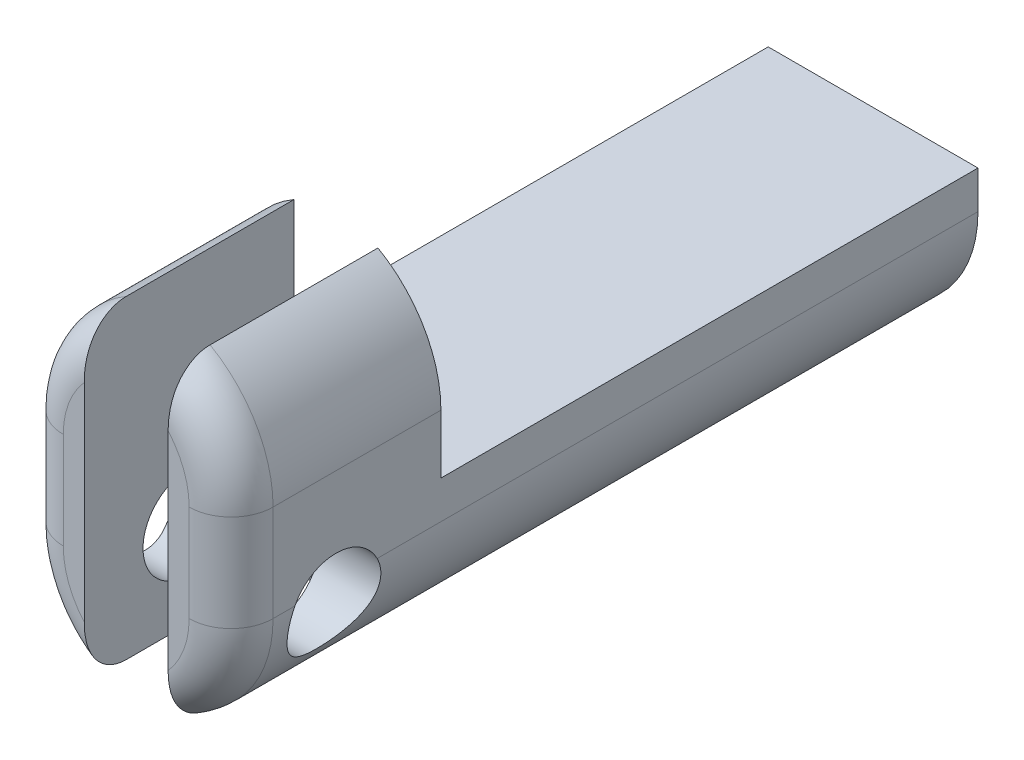
ISO-10303-21;
HEADER;
FILE_DESCRIPTION(('STEP AP214'),'2;1');
FILE_NAME('part.step','',(''),(''),'','','');
FILE_SCHEMA(('AUTOMOTIVE_DESIGN { 1 0 10303 214 1 1 1 1 }'));
ENDSEC;
DATA;
#1=APPLICATION_CONTEXT('core data for automotive mechanical design processes');
#2=APPLICATION_PROTOCOL_DEFINITION('international standard','automotive_design',2000,#1);
#3=PRODUCT_CONTEXT('',#1,'mechanical');
#4=PRODUCT('Part','Part','',(#3));
#5=PRODUCT_RELATED_PRODUCT_CATEGORY('part','',(#4));
#6=PRODUCT_DEFINITION_FORMATION('','',#4);
#7=PRODUCT_DEFINITION_CONTEXT('part definition',#1,'design');
#8=PRODUCT_DEFINITION('design','',#6,#7);
#9=PRODUCT_DEFINITION_SHAPE('','',#8);
#10=(LENGTH_UNIT() NAMED_UNIT(*) SI_UNIT(.MILLI.,.METRE.));
#11=(NAMED_UNIT(*) PLANE_ANGLE_UNIT() SI_UNIT($,.RADIAN.));
#12=(NAMED_UNIT(*) SI_UNIT($,.STERADIAN.) SOLID_ANGLE_UNIT());
#13=UNCERTAINTY_MEASURE_WITH_UNIT(LENGTH_MEASURE(1.E-05),#10,'distance_accuracy_value','');
#14=(GEOMETRIC_REPRESENTATION_CONTEXT(3) GLOBAL_UNCERTAINTY_ASSIGNED_CONTEXT((#13)) GLOBAL_UNIT_ASSIGNED_CONTEXT((#10,
#11,#12)) REPRESENTATION_CONTEXT('',''));
#15=CARTESIAN_POINT('',(0.,0.,0.));
#16=DIRECTION('',(0.,0.,1.));
#17=DIRECTION('',(1.,0.,0.));
#18=AXIS2_PLACEMENT_3D('',#15,#16,#17);
#19=CARTESIAN_POINT('',(0.,0.,12.8));
#20=DIRECTION('',(0.,0.,1.));
#21=DIRECTION('',(1.,0.,0.));
#22=AXIS2_PLACEMENT_3D('',#19,#20,#21);
#23=PLANE('',#22);
#24=DIRECTION('',(0.,1.,0.));
#25=VECTOR('',#24,1.);
#26=CARTESIAN_POINT('',(-1.,-1.95,12.8));
#27=LINE('',#26,#25);
#28=CARTESIAN_POINT('',(-1.,-1.54807621135331,12.8));
#29=VERTEX_POINT('',#28);
#30=CARTESIAN_POINT('',(-1.,1.95,12.8));
#31=VERTEX_POINT('',#30);
#32=EDGE_CURVE('E203',#29,#31,#27,.T.);
#33=ORIENTED_EDGE('',*,*,#32,.F.);
#34=CARTESIAN_POINT('',(0.5,1.05,12.8));
#35=DIRECTION('',(0.,0.,1.));
#36=DIRECTION('',(1.,0.,0.));
#37=AXIS2_PLACEMENT_3D('',#34,#35,#36);
#38=CIRCLE('',#37,3.);
#39=CARTESIAN_POINT('',(0.,-1.90803989154981,12.8));
#40=VERTEX_POINT('',#39);
#41=EDGE_CURVE('E498',#29,#40,#38,.T.);
#42=ORIENTED_EDGE('',*,*,#41,.T.);
#43=CARTESIAN_POINT('',(-0.5,1.05,12.8));
#44=DIRECTION('',(0.,0.,1.));
#45=DIRECTION('',(1.,0.,0.));
#46=AXIS2_PLACEMENT_3D('',#43,#44,#45);
#47=CIRCLE('',#46,3.);
#48=CARTESIAN_POINT('',(1.,-1.54807621135331,12.8));
#49=VERTEX_POINT('',#48);
#50=EDGE_CURVE('E500',#40,#49,#47,.T.);
#51=ORIENTED_EDGE('',*,*,#50,.T.);
#52=DIRECTION('',(0.,-1.,0.));
#53=VECTOR('',#52,1.);
#54=CARTESIAN_POINT('',(1.,5.95,12.8));
#55=LINE('',#54,#53);
#56=CARTESIAN_POINT('',(1.,1.95,12.8));
#57=VERTEX_POINT('',#56);
#58=EDGE_CURVE('E227',#57,#49,#55,.T.);
#59=ORIENTED_EDGE('',*,*,#58,.F.);
#60=DIRECTION('',(-1.,0.,0.));
#61=VECTOR('',#60,1.);
#62=CARTESIAN_POINT('',(2.5,1.95,12.8));
#63=LINE('',#62,#61);
#64=EDGE_CURVE('E244',#57,#31,#63,.T.);
#65=ORIENTED_EDGE('',*,*,#64,.T.);
#66=EDGE_LOOP('',(#33,#42,#51,#59,#65));
#67=FACE_BOUND('',#66,.T.);
#68=ADVANCED_FACE('F47',(#67),#23,.T.);
#69=CARTESIAN_POINT('',(2.5,-1.95,12.8));
#70=DIRECTION('',(-1.,0.,0.));
#71=DIRECTION('',(0.,-1.,0.));
#72=AXIS2_PLACEMENT_3D('',#69,#70,#71);
#73=PLANE('',#72);
#74=DIRECTION('',(0.,0.,1.));
#75=VECTOR('',#74,1.);
#76=CARTESIAN_POINT('',(2.5,3.35192378864669,12.8));
#77=LINE('',#76,#75);
#78=CARTESIAN_POINT('',(2.5,3.35192378864669,12.8));
#79=VERTEX_POINT('',#78);
#80=CARTESIAN_POINT('',(2.5,3.35192378864669,16.8));
#81=VERTEX_POINT('',#80);
#82=EDGE_CURVE('E422',#79,#81,#77,.T.);
#83=ORIENTED_EDGE('',*,*,#82,.T.);
#84=DIRECTION('',(0.,1.,0.));
#85=VECTOR('',#84,1.);
#86=CARTESIAN_POINT('',(2.5,1.05,16.8));
#87=LINE('',#86,#85);
#88=CARTESIAN_POINT('',(2.5,1.05,16.8));
#89=VERTEX_POINT('',#88);
#90=EDGE_CURVE('E425',#81,#89,#87,.F.);
#91=ORIENTED_EDGE('',*,*,#90,.T.);
#92=DIRECTION('',(0.,0.,-1.));
#93=VECTOR('',#92,1.);
#94=CARTESIAN_POINT('',(2.5,1.05,12.8));
#95=LINE('',#94,#93);
#96=CARTESIAN_POINT('',(2.5,1.05,16.2797958971133));
#97=VERTEX_POINT('',#96);
#98=EDGE_CURVE('E316',#89,#97,#95,.T.);
#99=ORIENTED_EDGE('',*,*,#98,.T.);
#100=CARTESIAN_POINT('',(2.5,0.55,15.3));
#101=DIRECTION('',(1.,0.,0.));
#102=DIRECTION('',(0.,1.,0.));
#103=AXIS2_PLACEMENT_3D('',#100,#101,#102);
#104=CIRCLE('',#103,1.1);
#105=CARTESIAN_POINT('',(2.5,1.05,14.3202041028867));
#106=VERTEX_POINT('',#105);
#107=EDGE_CURVE('E511',#106,#97,#104,.T.);
#108=ORIENTED_EDGE('',*,*,#107,.F.);
#109=DIRECTION('',(0.,0.,-1.));
#110=VECTOR('',#109,1.);
#111=CARTESIAN_POINT('',(2.5,1.05,12.8));
#112=LINE('',#111,#110);
#113=CARTESIAN_POINT('',(2.5,1.05,0.));
#114=VERTEX_POINT('',#113);
#115=EDGE_CURVE('E503',#106,#114,#112,.T.);
#116=ORIENTED_EDGE('',*,*,#115,.T.);
#117=DIRECTION('',(0.,1.,0.));
#118=VECTOR('',#117,1.);
#119=CARTESIAN_POINT('',(2.5,-1.95,0.));
#120=LINE('',#119,#118);
#121=CARTESIAN_POINT('',(2.5,1.95,0.));
#122=VERTEX_POINT('',#121);
#123=EDGE_CURVE('E235',#114,#122,#120,.T.);
#124=ORIENTED_EDGE('',*,*,#123,.T.);
#125=DIRECTION('',(0.,0.,-1.));
#126=VECTOR('',#125,1.);
#127=CARTESIAN_POINT('',(2.5,1.95,12.8));
#128=LINE('',#127,#126);
#129=CARTESIAN_POINT('',(2.5,1.95,12.8));
#130=VERTEX_POINT('',#129);
#131=EDGE_CURVE('E258',#130,#122,#128,.T.);
#132=ORIENTED_EDGE('',*,*,#131,.F.);
#133=DIRECTION('',(0.,1.,0.));
#134=VECTOR('',#133,1.);
#135=CARTESIAN_POINT('',(2.5,-1.95,12.8));
#136=LINE('',#135,#134);
#137=EDGE_CURVE('E209',#130,#79,#136,.T.);
#138=ORIENTED_EDGE('',*,*,#137,.T.);
#139=EDGE_LOOP('',(#83,#91,#99,#108,#116,#124,#132,#138));
#140=FACE_BOUND('',#139,.T.);
#141=ADVANCED_FACE('F405',(#140),#73,.F.);
#142=CARTESIAN_POINT('',(2.5,1.95,12.8));
#143=DIRECTION('',(0.,-1.,0.));
#144=DIRECTION('',(1.,0.,0.));
#145=AXIS2_PLACEMENT_3D('',#142,#143,#144);
#146=PLANE('',#145);
#147=DIRECTION('',(-1.,0.,0.));
#148=VECTOR('',#147,1.);
#149=CARTESIAN_POINT('',(2.5,1.95,0.));
#150=LINE('',#149,#148);
#151=CARTESIAN_POINT('',(-2.5,1.95,0.));
#152=VERTEX_POINT('',#151);
#153=EDGE_CURVE('E248',#122,#152,#150,.T.);
#154=ORIENTED_EDGE('',*,*,#153,.T.);
#155=DIRECTION('',(0.,0.,-1.));
#156=VECTOR('',#155,1.);
#157=CARTESIAN_POINT('',(-2.5,1.95,12.8));
#158=LINE('',#157,#156);
#159=CARTESIAN_POINT('',(-2.5,1.95,12.8));
#160=VERTEX_POINT('',#159);
#161=EDGE_CURVE('E243',#160,#152,#158,.T.);
#162=ORIENTED_EDGE('',*,*,#161,.F.);
#163=EDGE_CURVE('E245',#31,#160,#63,.T.);
#164=ORIENTED_EDGE('',*,*,#163,.F.);
#165=ORIENTED_EDGE('',*,*,#64,.F.);
#166=EDGE_CURVE('E239',#130,#57,#63,.T.);
#167=ORIENTED_EDGE('',*,*,#166,.F.);
#168=ORIENTED_EDGE('',*,*,#131,.T.);
#169=EDGE_LOOP('',(#154,#162,#164,#165,#167,#168));
#170=FACE_BOUND('',#169,.T.);
#171=ADVANCED_FACE('F413',(#170),#146,.F.);
#172=CARTESIAN_POINT('',(-2.5,1.95,12.8));
#173=DIRECTION('',(1.,0.,0.));
#174=DIRECTION('',(0.,1.,0.));
#175=AXIS2_PLACEMENT_3D('',#172,#173,#174);
#176=PLANE('',#175);
#177=DIRECTION('',(0.,0.,-1.));
#178=VECTOR('',#177,1.);
#179=CARTESIAN_POINT('',(-2.5,1.05,12.8));
#180=LINE('',#179,#178);
#181=CARTESIAN_POINT('',(-2.5,1.05,16.2797958971133));
#182=VERTEX_POINT('',#181);
#183=CARTESIAN_POINT('',(-2.5,1.05,16.8));
#184=VERTEX_POINT('',#183);
#185=EDGE_CURVE('E273',#182,#184,#180,.F.);
#186=ORIENTED_EDGE('',*,*,#185,.T.);
#187=DIRECTION('',(0.,-1.,0.));
#188=VECTOR('',#187,1.);
#189=CARTESIAN_POINT('',(-2.5,3.35192378864669,16.8));
#190=LINE('',#189,#188);
#191=CARTESIAN_POINT('',(-2.5,3.35192378864668,16.8));
#192=VERTEX_POINT('',#191);
#193=EDGE_CURVE('E354',#184,#192,#190,.F.);
#194=ORIENTED_EDGE('',*,*,#193,.T.);
#195=DIRECTION('',(0.,0.,-1.));
#196=VECTOR('',#195,1.);
#197=CARTESIAN_POINT('',(-2.5,3.35192378864668,12.8));
#198=LINE('',#197,#196);
#199=CARTESIAN_POINT('',(-2.5,3.35192378864669,12.8));
#200=VERTEX_POINT('',#199);
#201=EDGE_CURVE('E198',#192,#200,#198,.T.);
#202=ORIENTED_EDGE('',*,*,#201,.T.);
#203=DIRECTION('',(0.,-1.,0.));
#204=VECTOR('',#203,1.);
#205=CARTESIAN_POINT('',(-2.5,5.95,12.8));
#206=LINE('',#205,#204);
#207=EDGE_CURVE('E195',#200,#160,#206,.T.);
#208=ORIENTED_EDGE('',*,*,#207,.T.);
#209=ORIENTED_EDGE('',*,*,#161,.T.);
#210=DIRECTION('',(0.,-1.,0.));
#211=VECTOR('',#210,1.);
#212=CARTESIAN_POINT('',(-2.5,1.95,0.));
#213=LINE('',#212,#211);
#214=CARTESIAN_POINT('',(-2.5,1.05,0.));
#215=VERTEX_POINT('',#214);
#216=EDGE_CURVE('E251',#152,#215,#213,.T.);
#217=ORIENTED_EDGE('',*,*,#216,.T.);
#218=DIRECTION('',(0.,0.,-1.));
#219=VECTOR('',#218,1.);
#220=CARTESIAN_POINT('',(-2.5,1.05,12.8));
#221=LINE('',#220,#219);
#222=CARTESIAN_POINT('',(-2.5,1.05,14.3202041028867));
#223=VERTEX_POINT('',#222);
#224=EDGE_CURVE('E277',#215,#223,#221,.F.);
#225=ORIENTED_EDGE('',*,*,#224,.T.);
#226=CARTESIAN_POINT('',(-2.5,0.549999999999999,15.3));
#227=DIRECTION('',(1.,0.,0.));
#228=DIRECTION('',(0.,1.,0.));
#229=AXIS2_PLACEMENT_3D('',#226,#227,#228);
#230=CIRCLE('',#229,1.1);
#231=EDGE_CURVE('E266',#223,#182,#230,.T.);
#232=ORIENTED_EDGE('',*,*,#231,.T.);
#233=EDGE_LOOP('',(#186,#194,#202,#208,#209,#217,#225,#232));
#234=FACE_BOUND('',#233,.T.);
#235=ADVANCED_FACE('F409',(#234),#176,.F.);
#236=CARTESIAN_POINT('',(0.,0.,0.));
#237=DIRECTION('',(0.,0.,1.));
#238=DIRECTION('',(1.,0.,0.));
#239=AXIS2_PLACEMENT_3D('',#236,#237,#238);
#240=PLANE('',#239);
#241=CARTESIAN_POINT('',(0.,-0.0499999999999999,0.));
#242=DIRECTION('',(0.,0.,-1.));
#243=DIRECTION('',(-1.,0.,0.));
#244=AXIS2_PLACEMENT_3D('',#241,#242,#243);
#245=CIRCLE('',#244,1.);
#246=CARTESIAN_POINT('',(-1.,-0.0499999999999999,0.));
#247=VERTEX_POINT('',#246);
#248=EDGE_CURVE('E230',#247,#247,#245,.T.);
#249=ORIENTED_EDGE('',*,*,#248,.F.);
#250=EDGE_LOOP('',(#249));
#251=FACE_BOUND('',#250,.T.);
#252=CARTESIAN_POINT('',(-0.5,1.05,0.));
#253=DIRECTION('',(0.,0.,1.));
#254=DIRECTION('',(1.,0.,0.));
#255=AXIS2_PLACEMENT_3D('',#252,#253,#254);
#256=CIRCLE('',#255,3.);
#257=CARTESIAN_POINT('',(0.,-1.90803989154981,0.));
#258=VERTEX_POINT('',#257);
#259=EDGE_CURVE('E267',#114,#258,#256,.F.);
#260=ORIENTED_EDGE('',*,*,#259,.T.);
#261=CARTESIAN_POINT('',(0.5,1.05,0.));
#262=DIRECTION('',(0.,0.,1.));
#263=DIRECTION('',(1.,0.,0.));
#264=AXIS2_PLACEMENT_3D('',#261,#262,#263);
#265=CIRCLE('',#264,3.);
#266=EDGE_CURVE('E270',#258,#215,#265,.F.);
#267=ORIENTED_EDGE('',*,*,#266,.T.);
#268=ORIENTED_EDGE('',*,*,#216,.F.);
#269=ORIENTED_EDGE('',*,*,#153,.F.);
#270=ORIENTED_EDGE('',*,*,#123,.F.);
#271=EDGE_LOOP('',(#260,#267,#268,#269,#270));
#272=FACE_BOUND('',#271,.T.);
#273=ADVANCED_FACE('F401',(#251,#272),#240,.F.);
#274=CARTESIAN_POINT('',(0.,-0.0499999999999999,5.));
#275=DIRECTION('',(0.,0.,-1.));
#276=DIRECTION('',(-1.,0.,0.));
#277=AXIS2_PLACEMENT_3D('',#274,#275,#276);
#278=CYLINDRICAL_SURFACE('',#277,1.);
#279=CARTESIAN_POINT('',(0.,-0.0499999999999999,5.));
#280=DIRECTION('',(0.,0.,-1.));
#281=DIRECTION('',(-1.,0.,0.));
#282=AXIS2_PLACEMENT_3D('',#279,#280,#281);
#283=CIRCLE('',#282,1.);
#284=CARTESIAN_POINT('',(-1.,-0.0499999999999999,5.));
#285=VERTEX_POINT('',#284);
#286=EDGE_CURVE('E231',#285,#285,#283,.T.);
#287=ORIENTED_EDGE('',*,*,#286,.F.);
#288=EDGE_LOOP('',(#287));
#289=FACE_BOUND('',#288,.T.);
#290=ORIENTED_EDGE('',*,*,#248,.T.);
#291=EDGE_LOOP('',(#290));
#292=FACE_BOUND('',#291,.T.);
#293=ADVANCED_FACE('F397',(#289,#292),#278,.F.);
#294=CARTESIAN_POINT('',(0.,-0.0499999999999999,5.));
#295=DIRECTION('',(0.,0.,-1.));
#296=DIRECTION('',(-1.,0.,0.));
#297=AXIS2_PLACEMENT_3D('',#294,#295,#296);
#298=PLANE('',#297);
#299=ORIENTED_EDGE('',*,*,#286,.T.);
#300=EDGE_LOOP('',(#299));
#301=FACE_BOUND('',#300,.T.);
#302=ADVANCED_FACE('F393',(#301),#298,.T.);
#303=CARTESIAN_POINT('',(0.,0.,12.8));
#304=DIRECTION('',(0.,0.,1.));
#305=DIRECTION('',(1.,0.,0.));
#306=AXIS2_PLACEMENT_3D('',#303,#304,#305);
#307=PLANE('',#306);
#308=CARTESIAN_POINT('',(1.,5.95,12.8));
#309=VERTEX_POINT('',#308);
#310=EDGE_CURVE('E220',#309,#57,#55,.T.);
#311=ORIENTED_EDGE('',*,*,#310,.F.);
#312=CARTESIAN_POINT('',(-0.500000000000001,3.35192378864669,12.8));
#313=DIRECTION('',(0.,0.,1.));
#314=DIRECTION('',(1.,0.,0.));
#315=AXIS2_PLACEMENT_3D('',#312,#313,#314);
#316=CIRCLE('',#315,3.);
#317=EDGE_CURVE('E431',#309,#79,#316,.F.);
#318=ORIENTED_EDGE('',*,*,#317,.T.);
#319=ORIENTED_EDGE('',*,*,#137,.F.);
#320=ORIENTED_EDGE('',*,*,#166,.T.);
#321=EDGE_LOOP('',(#311,#318,#319,#320));
#322=FACE_BOUND('',#321,.T.);
#323=ADVANCED_FACE('F390',(#322),#307,.F.);
#324=CARTESIAN_POINT('',(1.,5.95,17.8));
#325=DIRECTION('',(1.,0.,0.));
#326=DIRECTION('',(0.,1.,0.));
#327=AXIS2_PLACEMENT_3D('',#324,#325,#326);
#328=PLANE('',#327);
#329=CARTESIAN_POINT('',(1.,0.55,15.3));
#330=DIRECTION('',(1.,0.,0.));
#331=DIRECTION('',(0.,1.,0.));
#332=AXIS2_PLACEMENT_3D('',#329,#330,#331);
#333=CIRCLE('',#332,1.1);
#334=CARTESIAN_POINT('',(1.,1.65,15.3));
#335=VERTEX_POINT('',#334);
#336=EDGE_CURVE('E188',#335,#335,#333,.T.);
#337=ORIENTED_EDGE('',*,*,#336,.T.);
#338=EDGE_LOOP('',(#337));
#339=FACE_BOUND('',#338,.T.);
#340=DIRECTION('',(0.,0.,-1.));
#341=VECTOR('',#340,1.);
#342=CARTESIAN_POINT('',(1.,-1.54807621135331,12.8));
#343=LINE('',#342,#341);
#344=CARTESIAN_POINT('',(1.,-1.54807621135331,16.8));
#345=VERTEX_POINT('',#344);
#346=EDGE_CURVE('E315',#49,#345,#343,.F.);
#347=ORIENTED_EDGE('',*,*,#346,.T.);
#348=CARTESIAN_POINT('',(1.,-1.54807621135331,16.8));
#349=CARTESIAN_POINT('',(1.,-1.54807725914633,16.8251406847583));
#350=CARTESIAN_POINT('',(1.,-1.54698065946931,16.8502685668927));
#351=CARTESIAN_POINT('',(1.,-1.54261438234622,16.900328936466));
#352=CARTESIAN_POINT('',(1.,-1.53934521876122,16.9252614686989));
#353=CARTESIAN_POINT('',(1.,-1.5263496303355,16.9993115535053));
#354=CARTESIAN_POINT('',(1.,-1.51343464765721,17.0479055951085));
#355=CARTESIAN_POINT('',(1.,-1.4796536253242,17.142178750274));
#356=CARTESIAN_POINT('',(1.,-1.4587909675325,17.1878590940229));
#357=CARTESIAN_POINT('',(1.,-1.40994657000291,17.2752643100235));
#358=CARTESIAN_POINT('',(1.,-1.38196003228096,17.3169864903239));
#359=CARTESIAN_POINT('',(1.,-1.31875392479306,17.3970609651217));
#360=CARTESIAN_POINT('',(1.,-1.28330492965585,17.4352313100873));
#361=CARTESIAN_POINT('',(1.,-1.20712280502602,17.5057933749693));
#362=CARTESIAN_POINT('',(1.,-1.16639148314499,17.5381870626922));
#363=CARTESIAN_POINT('',(1.,-1.07590246834451,17.6003751325615));
#364=CARTESIAN_POINT('',(1.,-1.02564549967454,17.6294397519124));
#365=CARTESIAN_POINT('',(1.,-0.921421688220997,17.6802708822217));
#366=CARTESIAN_POINT('',(1.,-0.867444020593917,17.7020149135557));
#367=CARTESIAN_POINT('',(1.,-0.768850520511441,17.7346660221151));
#368=CARTESIAN_POINT('',(1.,-0.72465958888246,17.7468912713283));
#369=CARTESIAN_POINT('',(1.,-0.635311226021322,17.767327414319));
#370=CARTESIAN_POINT('',(1.,-0.590152725960768,17.7755336015126));
#371=CARTESIAN_POINT('',(1.,-0.499677705766262,17.788241581347));
#372=CARTESIAN_POINT('',(1.,-0.454364851015855,17.7927704373744));
#373=CARTESIAN_POINT('',(1.,-0.363648587751608,17.7986485197849));
#374=CARTESIAN_POINT('',(1.,-0.318245735653481,17.8000061235642));
#375=CARTESIAN_POINT('',(1.,-0.272875655532291,17.8));
#376=B_SPLINE_CURVE_WITH_KNOTS('',3,(#348,#349,#350,#351,#352,#353,#354,#355,#356,#357,#358,
#359,#360,#361,#362,#363,#364,#365,#366,#367,#368,#369,#370,#371,#372,#373,#374,#375),
.UNSPECIFIED.,.F.,.F.,(4,2,2,2,2,2,2,2,2,2,2,2,2,4),(0.,0.0753730667781095,0.150728312443982,
0.300775834916644,0.4507595809538,0.600844610634781,0.756486181483537,0.912074631652492,
1.08559343957753,1.25964031970297,1.39700085280497,1.5345218617056,1.67102136755648,
1.80715987720724),.UNSPECIFIED.);
#377=CARTESIAN_POINT('',(1.,-0.272875655532292,17.8));
#378=VERTEX_POINT('',#377);
#379=EDGE_CURVE('E377',#345,#378,#376,.T.);
#380=ORIENTED_EDGE('',*,*,#379,.T.);
#381=DIRECTION('',(0.,-1.,0.));
#382=VECTOR('',#381,1.);
#383=CARTESIAN_POINT('',(1.,5.95,17.8));
#384=LINE('',#383,#382);
#385=CARTESIAN_POINT('',(1.,4.67479944417898,17.8));
#386=VERTEX_POINT('',#385);
#387=EDGE_CURVE('E215',#386,#378,#384,.T.);
#388=ORIENTED_EDGE('',*,*,#387,.F.);
#389=CARTESIAN_POINT('',(1.,4.67479944417898,17.8));
#390=CARTESIAN_POINT('',(1.,4.71675625596289,17.7999989393293));
#391=CARTESIAN_POINT('',(1.,4.75871017369403,17.7988425833565));
#392=CARTESIAN_POINT('',(1.,4.84253599382319,17.793857632656));
#393=CARTESIAN_POINT('',(1.,4.88440758345179,17.7900239044614));
#394=CARTESIAN_POINT('',(1.,5.01016984732891,17.7738870918663));
#395=CARTESIAN_POINT('',(1.,5.09356963696818,17.7569371640736));
#396=CARTESIAN_POINT('',(1.,5.23817865557275,17.7137610222486));
#397=CARTESIAN_POINT('',(1.,5.30023681763883,17.6903918563686));
#398=CARTESIAN_POINT('',(1.,5.41975410668399,17.6341327039551));
#399=CARTESIAN_POINT('',(1.,5.47722574797194,17.6012698395454));
#400=CARTESIAN_POINT('',(1.,5.58603205208033,17.5254695780934));
#401=CARTESIAN_POINT('',(1.,5.63730014137853,17.482435424956));
#402=CARTESIAN_POINT('',(1.,5.73043849609253,17.3870613922921));
#403=CARTESIAN_POINT('',(1.,5.77230918444428,17.3347219317469));
#404=CARTESIAN_POINT('',(1.,5.83912089504805,17.2301197733585));
#405=CARTESIAN_POINT('',(1.,5.86559808003096,17.1788359349474));
#406=CARTESIAN_POINT('',(1.,5.90823704778491,17.0721882430949));
#407=CARTESIAN_POINT('',(1.,5.92442011866108,17.0168330755035));
#408=CARTESIAN_POINT('',(1.,5.93999883408434,16.9340355638157));
#409=CARTESIAN_POINT('',(1.,5.94374595856035,16.9073513164836));
#410=CARTESIAN_POINT('',(1.,5.94874517558553,16.8537837444793));
#411=CARTESIAN_POINT('',(1.,5.95000036822994,16.8269007089758));
#412=CARTESIAN_POINT('',(1.,5.95,16.8));
#413=B_SPLINE_CURVE_WITH_KNOTS('',3,(#389,#390,#391,#392,#393,#394,#395,#396,#397,#398,#399,
#400,#401,#402,#403,#404,#405,#406,#407,#408,#409,#410,#411,#412),.UNSPECIFIED.,.F.,.F.,(4,2,2,
2,2,2,2,2,2,2,2,4),(0.,0.125836261070076,0.251914459419313,0.505971113407062,0.704197736514723,
0.901863562271495,1.10149129552346,1.30111004260129,1.47328300541919,1.64509874904635,
1.72583748095619,1.80647570650619),.UNSPECIFIED.);
#414=CARTESIAN_POINT('',(1.,5.95,16.8));
#415=VERTEX_POINT('',#414);
#416=EDGE_CURVE('E72',#386,#415,#413,.T.);
#417=ORIENTED_EDGE('',*,*,#416,.T.);
#418=DIRECTION('',(0.,0.,-1.));
#419=VECTOR('',#418,1.);
#420=CARTESIAN_POINT('',(1.,5.95,17.8));
#421=LINE('',#420,#419);
#422=EDGE_CURVE('E219',#415,#309,#421,.T.);
#423=ORIENTED_EDGE('',*,*,#422,.T.);
#424=ORIENTED_EDGE('',*,*,#310,.T.);
#425=ORIENTED_EDGE('',*,*,#58,.T.);
#426=EDGE_LOOP('',(#347,#380,#388,#417,#423,#424,#425));
#427=FACE_BOUND('',#426,.T.);
#428=ADVANCED_FACE('F384',(#339,#427),#328,.F.);
#429=CARTESIAN_POINT('',(0.,0.,17.8));
#430=DIRECTION('',(0.,0.,1.));
#431=DIRECTION('',(1.,0.,0.));
#432=AXIS2_PLACEMENT_3D('',#429,#430,#431);
#433=PLANE('',#432);
#434=ORIENTED_EDGE('',*,*,#387,.T.);
#435=CARTESIAN_POINT('',(-0.5,1.05,17.8));
#436=DIRECTION('',(0.,0.,1.));
#437=DIRECTION('',(1.,0.,0.));
#438=AXIS2_PLACEMENT_3D('',#435,#436,#437);
#439=CIRCLE('',#438,2.);
#440=CARTESIAN_POINT('',(1.5,1.05,17.8));
#441=VERTEX_POINT('',#440);
#442=EDGE_CURVE('E363',#378,#441,#439,.T.);
#443=ORIENTED_EDGE('',*,*,#442,.T.);
#444=DIRECTION('',(0.,1.,0.));
#445=VECTOR('',#444,1.);
#446=CARTESIAN_POINT('',(1.5,3.35192378864669,17.8));
#447=LINE('',#446,#445);
#448=CARTESIAN_POINT('',(1.5,3.35192378864669,17.8));
#449=VERTEX_POINT('',#448);
#450=EDGE_CURVE('E360',#441,#449,#447,.T.);
#451=ORIENTED_EDGE('',*,*,#450,.T.);
#452=CARTESIAN_POINT('',(-0.500000000000001,3.35192378864669,17.8));
#453=DIRECTION('',(0.,0.,1.));
#454=DIRECTION('',(1.,0.,0.));
#455=AXIS2_PLACEMENT_3D('',#452,#453,#454);
#456=CIRCLE('',#455,2.);
#457=EDGE_CURVE('E357',#449,#386,#456,.T.);
#458=ORIENTED_EDGE('',*,*,#457,.T.);
#459=EDGE_LOOP('',(#434,#443,#451,#458));
#460=FACE_BOUND('',#459,.T.);
#461=ADVANCED_FACE('F389',(#460),#433,.T.);
#462=CARTESIAN_POINT('',(0.,0.,12.8));
#463=DIRECTION('',(0.,0.,1.));
#464=DIRECTION('',(1.,0.,0.));
#465=AXIS2_PLACEMENT_3D('',#462,#463,#464);
#466=PLANE('',#465);
#467=ORIENTED_EDGE('',*,*,#207,.F.);
#468=CARTESIAN_POINT('',(0.499999999999999,3.35192378864669,12.8));
#469=DIRECTION('',(0.,0.,1.));
#470=DIRECTION('',(1.,0.,0.));
#471=AXIS2_PLACEMENT_3D('',#468,#469,#470);
#472=CIRCLE('',#471,3.);
#473=CARTESIAN_POINT('',(-1.,5.95,12.8));
#474=VERTEX_POINT('',#473);
#475=EDGE_CURVE('E180',#200,#474,#472,.F.);
#476=ORIENTED_EDGE('',*,*,#475,.T.);
#477=EDGE_CURVE('E194',#31,#474,#27,.T.);
#478=ORIENTED_EDGE('',*,*,#477,.F.);
#479=ORIENTED_EDGE('',*,*,#163,.T.);
#480=EDGE_LOOP('',(#467,#476,#478,#479));
#481=FACE_BOUND('',#480,.T.);
#482=ADVANCED_FACE('F192',(#481),#466,.F.);
#483=CARTESIAN_POINT('',(-1.,-1.95,17.8));
#484=DIRECTION('',(-1.,0.,0.));
#485=DIRECTION('',(0.,-1.,0.));
#486=AXIS2_PLACEMENT_3D('',#483,#484,#485);
#487=PLANE('',#486);
#488=CARTESIAN_POINT('',(-1.,0.549999999999999,15.3));
#489=DIRECTION('',(-1.,0.,0.));
#490=DIRECTION('',(0.,-1.,0.));
#491=AXIS2_PLACEMENT_3D('',#488,#489,#490);
#492=CIRCLE('',#491,1.1);
#493=CARTESIAN_POINT('',(-1.,-0.550000000000002,15.3));
#494=VERTEX_POINT('',#493);
#495=EDGE_CURVE('E262',#494,#494,#492,.T.);
#496=ORIENTED_EDGE('',*,*,#495,.T.);
#497=EDGE_LOOP('',(#496));
#498=FACE_BOUND('',#497,.T.);
#499=DIRECTION('',(0.,1.,0.));
#500=VECTOR('',#499,1.);
#501=CARTESIAN_POINT('',(-1.,-1.95,17.8));
#502=LINE('',#501,#500);
#503=CARTESIAN_POINT('',(-1.,-0.272875655532293,17.8));
#504=VERTEX_POINT('',#503);
#505=CARTESIAN_POINT('',(-1.,4.67479944417898,17.8));
#506=VERTEX_POINT('',#505);
#507=EDGE_CURVE('E187',#504,#506,#502,.T.);
#508=ORIENTED_EDGE('',*,*,#507,.F.);
#509=CARTESIAN_POINT('',(-1.,-0.272875655532293,17.8));
#510=CARTESIAN_POINT('',(-1.,-0.314832467316202,17.7999989393293));
#511=CARTESIAN_POINT('',(-1.,-0.356786385047343,17.7988425833565));
#512=CARTESIAN_POINT('',(-1.,-0.440612205176507,17.793857632656));
#513=CARTESIAN_POINT('',(-1.,-0.482483794805106,17.7900239044614));
#514=CARTESIAN_POINT('',(-1.,-0.608246058682219,17.7738870918663));
#515=CARTESIAN_POINT('',(-1.,-0.691645848321489,17.7569371640736));
#516=CARTESIAN_POINT('',(-1.,-0.836254866926065,17.7137610222486));
#517=CARTESIAN_POINT('',(-1.,-0.898313028992143,17.6903918563686));
#518=CARTESIAN_POINT('',(-1.,-1.0178303180373,17.6341327039551));
#519=CARTESIAN_POINT('',(-1.,-1.07530195932525,17.6012698395454));
#520=CARTESIAN_POINT('',(-1.,-1.18410826343365,17.5254695780934));
#521=CARTESIAN_POINT('',(-1.,-1.23537635273184,17.482435424956));
#522=CARTESIAN_POINT('',(-1.,-1.32851470744585,17.3870613922921));
#523=CARTESIAN_POINT('',(-1.,-1.3703853957976,17.3347219317469));
#524=CARTESIAN_POINT('',(-1.,-1.43719710640137,17.2301197733585));
#525=CARTESIAN_POINT('',(-1.,-1.46367429138427,17.1788359349474));
#526=CARTESIAN_POINT('',(-1.,-1.50631325913823,17.0721882430949));
#527=CARTESIAN_POINT('',(-1.,-1.5224963300144,17.0168330755035));
#528=CARTESIAN_POINT('',(-1.,-1.53807504543765,16.9340355638157));
#529=CARTESIAN_POINT('',(-1.,-1.54182216991367,16.9073513164836));
#530=CARTESIAN_POINT('',(-1.,-1.54682138693884,16.8537837444793));
#531=CARTESIAN_POINT('',(-1.,-1.54807657958325,16.8269007089758));
#532=CARTESIAN_POINT('',(-1.,-1.54807621135331,16.8));
#533=B_SPLINE_CURVE_WITH_KNOTS('',3,(#509,#510,#511,#512,#513,#514,#515,#516,#517,#518,#519,
#520,#521,#522,#523,#524,#525,#526,#527,#528,#529,#530,#531,#532),.UNSPECIFIED.,.F.,.F.,(4,2,2,
2,2,2,2,2,2,2,2,4),(0.,0.125836261070075,0.251914459419312,0.505971113407062,0.704197736514723,
0.901863562271495,1.10149129552346,1.30111004260129,1.47328300541919,1.64509874904635,
1.72583748095619,1.80647570650619),.UNSPECIFIED.);
#534=CARTESIAN_POINT('',(-1.,-1.54807621135331,16.8));
#535=VERTEX_POINT('',#534);
#536=EDGE_CURVE('E337',#504,#535,#533,.T.);
#537=ORIENTED_EDGE('',*,*,#536,.T.);
#538=DIRECTION('',(0.,0.,-1.));
#539=VECTOR('',#538,1.);
#540=CARTESIAN_POINT('',(-1.,-1.54807621135331,17.8));
#541=LINE('',#540,#539);
#542=EDGE_CURVE('E290',#535,#29,#541,.T.);
#543=ORIENTED_EDGE('',*,*,#542,.T.);
#544=ORIENTED_EDGE('',*,*,#32,.T.);
#545=ORIENTED_EDGE('',*,*,#477,.T.);
#546=DIRECTION('',(0.,0.,-1.));
#547=VECTOR('',#546,1.);
#548=CARTESIAN_POINT('',(-1.,5.95,17.8));
#549=LINE('',#548,#547);
#550=CARTESIAN_POINT('',(-1.,5.95,16.8));
#551=VERTEX_POINT('',#550);
#552=EDGE_CURVE('E176',#551,#474,#549,.T.);
#553=ORIENTED_EDGE('',*,*,#552,.F.);
#554=CARTESIAN_POINT('',(-1.,5.95,16.8));
#555=CARTESIAN_POINT('',(-1.,5.95000104779302,16.8251406847583));
#556=CARTESIAN_POINT('',(-1.,5.948904448116,16.8502685668927));
#557=CARTESIAN_POINT('',(-1.,5.94453817099291,16.900328936466));
#558=CARTESIAN_POINT('',(-1.,5.9412690074079,16.9252614686989));
#559=CARTESIAN_POINT('',(-1.,5.92827341898218,16.9993115535053));
#560=CARTESIAN_POINT('',(-1.,5.9153584363039,17.0479055951085));
#561=CARTESIAN_POINT('',(-1.,5.88157741397089,17.142178750274));
#562=CARTESIAN_POINT('',(-1.,5.86071475617918,17.1878590940229));
#563=CARTESIAN_POINT('',(-1.,5.8118703586496,17.2752643100235));
#564=CARTESIAN_POINT('',(-1.,5.78388382092764,17.3169864903239));
#565=CARTESIAN_POINT('',(-1.,5.72067771343975,17.3970609651217));
#566=CARTESIAN_POINT('',(-1.,5.68522871830253,17.4352313100873));
#567=CARTESIAN_POINT('',(-1.,5.60904659367271,17.5057933749693));
#568=CARTESIAN_POINT('',(-1.,5.56831527179167,17.5381870626922));
#569=CARTESIAN_POINT('',(-1.,5.4778262569912,17.6003751325615));
#570=CARTESIAN_POINT('',(-1.,5.42756928832123,17.6294397519124));
#571=CARTESIAN_POINT('',(-1.,5.32334547686768,17.6802708822217));
#572=CARTESIAN_POINT('',(-1.,5.2693678092406,17.7020149135557));
#573=CARTESIAN_POINT('',(-1.,5.17077430915813,17.7346660221151));
#574=CARTESIAN_POINT('',(-1.,5.12658337752915,17.7468912713283));
#575=CARTESIAN_POINT('',(-1.,5.03723501466801,17.767327414319));
#576=CARTESIAN_POINT('',(-1.,4.99207651460746,17.7755336015126));
#577=CARTESIAN_POINT('',(-1.,4.90160149441295,17.788241581347));
#578=CARTESIAN_POINT('',(-1.,4.85628863966254,17.7927704373744));
#579=CARTESIAN_POINT('',(-1.,4.76557237639829,17.7986485197849));
#580=CARTESIAN_POINT('',(-1.,4.72016952430017,17.8000061235642));
#581=CARTESIAN_POINT('',(-1.,4.67479944417898,17.8));
#582=B_SPLINE_CURVE_WITH_KNOTS('',3,(#554,#555,#556,#557,#558,#559,#560,#561,#562,#563,#564,
#565,#566,#567,#568,#569,#570,#571,#572,#573,#574,#575,#576,#577,#578,#579,#580,#581),
.UNSPECIFIED.,.F.,.F.,(4,2,2,2,2,2,2,2,2,2,2,2,2,4),(0.,0.0753730667781095,0.150728312443975,
0.300775834916644,0.450759580953796,0.600844610634781,0.756486181483538,0.912074631652492,
1.08559343957753,1.25964031970297,1.39700085280498,1.5345218617056,1.67102136755648,
1.80715987720724),.UNSPECIFIED.);
#583=EDGE_CURVE('E346',#551,#506,#582,.T.);
#584=ORIENTED_EDGE('',*,*,#583,.T.);
#585=EDGE_LOOP('',(#508,#537,#543,#544,#545,#553,#584));
#586=FACE_BOUND('',#585,.T.);
#587=ADVANCED_FACE('F201',(#498,#586),#487,.F.);
#588=CARTESIAN_POINT('',(0.,0.,17.8));
#589=DIRECTION('',(0.,0.,1.));
#590=DIRECTION('',(1.,0.,0.));
#591=AXIS2_PLACEMENT_3D('',#588,#589,#590);
#592=PLANE('',#591);
#593=DIRECTION('',(0.,-1.,0.));
#594=VECTOR('',#593,1.);
#595=CARTESIAN_POINT('',(-1.5,1.05,17.8));
#596=LINE('',#595,#594);
#597=CARTESIAN_POINT('',(-1.5,3.35192378864668,17.8));
#598=VERTEX_POINT('',#597);
#599=CARTESIAN_POINT('',(-1.5,1.05,17.8));
#600=VERTEX_POINT('',#599);
#601=EDGE_CURVE('E476',#598,#600,#596,.T.);
#602=ORIENTED_EDGE('',*,*,#601,.T.);
#603=CARTESIAN_POINT('',(0.5,1.05,17.8));
#604=DIRECTION('',(0.,0.,1.));
#605=DIRECTION('',(1.,0.,0.));
#606=AXIS2_PLACEMENT_3D('',#603,#604,#605);
#607=CIRCLE('',#606,2.);
#608=EDGE_CURVE('E478',#600,#504,#607,.T.);
#609=ORIENTED_EDGE('',*,*,#608,.T.);
#610=ORIENTED_EDGE('',*,*,#507,.T.);
#611=CARTESIAN_POINT('',(0.499999999999999,3.35192378864669,17.8));
#612=DIRECTION('',(0.,0.,1.));
#613=DIRECTION('',(1.,0.,0.));
#614=AXIS2_PLACEMENT_3D('',#611,#612,#613);
#615=CIRCLE('',#614,2.);
#616=EDGE_CURVE('E197',#506,#598,#615,.T.);
#617=ORIENTED_EDGE('',*,*,#616,.T.);
#618=EDGE_LOOP('',(#602,#609,#610,#617));
#619=FACE_BOUND('',#618,.T.);
#620=ADVANCED_FACE('F486',(#619),#592,.T.);
#621=CARTESIAN_POINT('',(-2.5,0.549999999999999,15.3));
#622=DIRECTION('',(1.,0.,0.));
#623=DIRECTION('',(0.,1.,0.));
#624=AXIS2_PLACEMENT_3D('',#621,#622,#623);
#625=CYLINDRICAL_SURFACE('',#624,1.1);
#626=ORIENTED_EDGE('',*,*,#231,.F.);
#627=CARTESIAN_POINT('',(-2.5,1.05,14.3202041028867));
#628=CARTESIAN_POINT('',(-2.50000126347832,1.02374171135852,14.3068037336781));
#629=CARTESIAN_POINT('',(-2.49965472127382,0.996955203269736,14.2944662801828));
#630=CARTESIAN_POINT('',(-2.49819693642563,0.94249731858771,14.2719852292353));
#631=CARTESIAN_POINT('',(-2.49708569404779,0.914825942302119,14.2618416310203));
#632=CARTESIAN_POINT('',(-2.49251033123359,0.830907798818459,14.2348570092463));
#633=CARTESIAN_POINT('',(-2.48780538616572,0.773599491613857,14.2213820461134));
#634=CARTESIAN_POINT('',(-2.47484322130499,0.657953358346407,14.2037449191802));
#635=CARTESIAN_POINT('',(-2.4665834865066,0.59961483148133,14.1995893617906));
#636=CARTESIAN_POINT('',(-2.44663560179814,0.483605933032997,14.2004746252616));
#637=CARTESIAN_POINT('',(-2.43494744218935,0.42593556334038,14.2055154721383));
#638=CARTESIAN_POINT('',(-2.40842096605054,0.312063617129367,14.2244716319364));
#639=CARTESIAN_POINT('',(-2.39354522766882,0.255889280456208,14.2384966937387));
#640=CARTESIAN_POINT('',(-2.36143968444766,0.14701064408352,14.2748669009739));
#641=CARTESIAN_POINT('',(-2.34420873649738,0.0943080479289829,14.2972160957018));
#642=CARTESIAN_POINT('',(-2.30690583773881,-0.0104728807085244,14.3515207610744));
#643=CARTESIAN_POINT('',(-2.28671744930517,-0.0621974817451954,14.3840785667443));
#644=CARTESIAN_POINT('',(-2.24589412251524,-0.159484925677526,14.4571844949424));
#645=CARTESIAN_POINT('',(-2.22525892725619,-0.205044108271973,14.4977373291884));
#646=CARTESIAN_POINT('',(-2.18361245451272,-0.291900266891176,14.5890589703913));
#647=CARTESIAN_POINT('',(-2.16266952256448,-0.332703210175821,14.6403320187723));
#648=CARTESIAN_POINT('',(-2.12387511111051,-0.40497997356907,14.750155467814));
#649=CARTESIAN_POINT('',(-2.10602280243236,-0.436456297501023,14.8087039093215));
#650=CARTESIAN_POINT('',(-2.07632688427763,-0.487325021337384,14.9285555085829));
#651=CARTESIAN_POINT('',(-2.06422152907527,-0.507255510740455,14.989562257407));
#652=CARTESIAN_POINT('',(-2.04640703258383,-0.536225944964083,15.1149709912799));
#653=CARTESIAN_POINT('',(-2.04068718805575,-0.545284115624726,15.1793671048109));
#654=CARTESIAN_POINT('',(-2.03683636815769,-0.551394957235851,15.2994341632686));
#655=CARTESIAN_POINT('',(-2.03771529422303,-0.550013748973508,15.3549993876928));
#656=CARTESIAN_POINT('',(-2.04464971396233,-0.538961936654392,15.4649675360291));
#657=CARTESIAN_POINT('',(-2.05070555019982,-0.529290784040037,15.5193703827807));
#658=CARTESIAN_POINT('',(-2.06693724434876,-0.502758572147912,15.6231888893855));
#659=CARTESIAN_POINT('',(-2.07692679298333,-0.486221019161868,15.6727182604973));
#660=CARTESIAN_POINT('',(-2.10009331673485,-0.446675745091259,15.7683113151791));
#661=CARTESIAN_POINT('',(-2.11327122556094,-0.423666128345712,15.8143739783357));
#662=CARTESIAN_POINT('',(-2.14344274279393,-0.368905184155229,15.9073243813859));
#663=CARTESIAN_POINT('',(-2.16069928397346,-0.336459737135022,15.9537168665682));
#664=CARTESIAN_POINT('',(-2.19664003563853,-0.265190761424133,16.0406954057842));
#665=CARTESIAN_POINT('',(-2.21532514646817,-0.226363192433061,16.0812777509718));
#666=CARTESIAN_POINT('',(-2.25539997537747,-0.137617527763556,16.1609199308061));
#667=CARTESIAN_POINT('',(-2.27682467613096,-0.0869134693931015,16.1990913093588));
#668=CARTESIAN_POINT('',(-2.31847531437446,0.0206683271358693,16.2663502652865));
#669=CARTESIAN_POINT('',(-2.33870094796548,0.0775476201296608,16.2954355477321));
#670=CARTESIAN_POINT('',(-2.37697981053915,0.197351113219394,16.3439783938767));
#671=CARTESIAN_POINT('',(-2.39498526661743,0.260368564875128,16.3632454695137));
#672=CARTESIAN_POINT('',(-2.42720259609491,0.389759542647373,16.3902668453827));
#673=CARTESIAN_POINT('',(-2.44141670044452,0.456131067648992,16.3980279284127));
#674=CARTESIAN_POINT('',(-2.46435559913141,0.584680040992518,16.4011819321525));
#675=CARTESIAN_POINT('',(-2.47342564777449,0.64677399628591,16.3975045627449));
#676=CARTESIAN_POINT('',(-2.48753224634581,0.769865912924609,16.3795896461347));
#677=CARTESIAN_POINT('',(-2.49257340182677,0.83086504755942,16.3653641927541));
#678=CARTESIAN_POINT('',(-2.49720833270632,0.917686705445401,16.3371330903509));
#679=CARTESIAN_POINT('',(-2.49827365396047,0.944793207005324,16.3271193266688));
#680=CARTESIAN_POINT('',(-2.49966911130719,0.998099828825582,16.3050055068886));
#681=CARTESIAN_POINT('',(-2.50000066395087,1.02430159920049,16.2929095193205));
#682=CARTESIAN_POINT('',(-2.50000000000007,1.05000000000004,16.2797958971134));
#683=B_SPLINE_CURVE_WITH_KNOTS('',3,(#627,#628,#629,#630,#631,#632,#633,#634,#635,#636,#637,
#638,#639,#640,#641,#642,#643,#644,#645,#646,#647,#648,#649,#650,#651,#652,#653,#654,#655,#656,
#657,#658,#659,#660,#661,#662,#663,#664,#665,#666,#667,#668,#669,#670,#671,#672,#673,#674,#675,
#676,#677,#678,#679,#680,#681,#682),.UNSPECIFIED.,.F.,.F.,(4,2,2,2,2,2,2,2,2,2,2,2,2,2,2,2,2,2,
2,2,2,2,2,2,2,2,2,4),(0.,0.0883879299838289,0.176775829237127,0.353028263131317,
0.529405600738612,0.705783437306946,0.884358047285634,1.06301963901637,1.2552983003206,
1.44769061795685,1.65304639725264,1.85834699670225,2.05309201298988,2.24751010996065,
2.41341011121597,2.57932109116132,2.73817118993844,2.89706786428661,3.07392507127143,
3.25089467472091,3.45093895134724,3.65103371357326,3.85487545528704,4.05859698417463,
4.24620509350826,4.43359843420761,4.52026527088626,4.60676464947534),.UNSPECIFIED.);
#684=EDGE_CURVE('E281',#223,#182,#683,.T.);
#685=ORIENTED_EDGE('',*,*,#684,.T.);
#686=EDGE_LOOP('',(#626,#685));
#687=FACE_BOUND('',#686,.T.);
#688=ORIENTED_EDGE('',*,*,#495,.F.);
#689=EDGE_LOOP('',(#688));
#690=FACE_BOUND('',#689,.T.);
#691=ADVANCED_FACE('F301',(#687,#690),#625,.F.);
#692=ORIENTED_EDGE('',*,*,#107,.T.);
#693=CARTESIAN_POINT('',(2.5,1.05,16.2797958971133));
#694=CARTESIAN_POINT('',(2.50000126347832,1.02374171135852,16.2931962663219));
#695=CARTESIAN_POINT('',(2.49965472127382,0.996955203269736,16.3055337198172));
#696=CARTESIAN_POINT('',(2.49819693642563,0.942497318587711,16.3280147707647));
#697=CARTESIAN_POINT('',(2.49708569404779,0.914825942302119,16.3381583689797));
#698=CARTESIAN_POINT('',(2.49251033123359,0.830907798818459,16.3651429907537));
#699=CARTESIAN_POINT('',(2.48780538616572,0.773599491613857,16.3786179538866));
#700=CARTESIAN_POINT('',(2.47484322130499,0.657953358346406,16.3962550808198));
#701=CARTESIAN_POINT('',(2.4665834865066,0.599614831481329,16.4004106382094));
#702=CARTESIAN_POINT('',(2.44663560179813,0.483605933032996,16.3995253747384));
#703=CARTESIAN_POINT('',(2.43494744218935,0.425935563340378,16.3944845278617));
#704=CARTESIAN_POINT('',(2.40842096605054,0.312063617129366,16.3755283680636));
#705=CARTESIAN_POINT('',(2.39354522766881,0.255889280456207,16.3615033062613));
#706=CARTESIAN_POINT('',(2.36143968444765,0.147010644083519,16.3251330990261));
#707=CARTESIAN_POINT('',(2.34420873649738,0.0943080479289811,16.3027839042982));
#708=CARTESIAN_POINT('',(2.3069058377388,-0.0104728807085272,16.2484792389256));
#709=CARTESIAN_POINT('',(2.28671744930517,-0.0621974817451983,16.2159214332557));
#710=CARTESIAN_POINT('',(2.24589412251524,-0.159484925677529,16.1428155050576));
#711=CARTESIAN_POINT('',(2.22525892725619,-0.205044108271975,16.1022626708116));
#712=CARTESIAN_POINT('',(2.18361245451271,-0.291900266891177,16.0109410296087));
#713=CARTESIAN_POINT('',(2.16266952256448,-0.332703210175823,15.9596679812277));
#714=CARTESIAN_POINT('',(2.12387511111051,-0.40497997356907,15.849844532186));
#715=CARTESIAN_POINT('',(2.10602280243236,-0.436456297501023,15.7912960906784));
#716=CARTESIAN_POINT('',(2.07632688427763,-0.487325021337384,15.6714444914171));
#717=CARTESIAN_POINT('',(2.06422152907527,-0.507255510740455,15.610437742593));
#718=CARTESIAN_POINT('',(2.04640703258382,-0.536225944964082,15.4850290087201));
#719=CARTESIAN_POINT('',(2.04068718805575,-0.545284115624726,15.4206328951891));
#720=CARTESIAN_POINT('',(2.03683636815769,-0.55139495723585,15.3005658367314));
#721=CARTESIAN_POINT('',(2.03771529422304,-0.550013748973506,15.2450006123072));
#722=CARTESIAN_POINT('',(2.04464971396233,-0.53896193665439,15.1350324639709));
#723=CARTESIAN_POINT('',(2.05070555019982,-0.529290784040035,15.0806296172193));
#724=CARTESIAN_POINT('',(2.06693724434876,-0.502758572147911,14.9768111106145));
#725=CARTESIAN_POINT('',(2.07692679298334,-0.486221019161866,14.9272817395027));
#726=CARTESIAN_POINT('',(2.10009331673486,-0.446675745091257,14.8316886848209));
#727=CARTESIAN_POINT('',(2.11327122556094,-0.42366612834571,14.7856260216643));
#728=CARTESIAN_POINT('',(2.14344274279393,-0.368905184155227,14.6926756186141));
#729=CARTESIAN_POINT('',(2.16069928397346,-0.33645973713502,14.6462831334318));
#730=CARTESIAN_POINT('',(2.19664003563853,-0.265190761424131,14.5593045942158));
#731=CARTESIAN_POINT('',(2.21532514646817,-0.226363192433058,14.5187222490282));
#732=CARTESIAN_POINT('',(2.25539997537748,-0.137617527763553,14.4390800691939));
#733=CARTESIAN_POINT('',(2.27682467613096,-0.0869134693930983,14.4009086906412));
#734=CARTESIAN_POINT('',(2.31847531437446,0.0206683271358734,14.3336497347135));
#735=CARTESIAN_POINT('',(2.33870094796548,0.0775476201296662,14.3045644522679));
#736=CARTESIAN_POINT('',(2.37697981053915,0.1973511132194,14.2560216061233));
#737=CARTESIAN_POINT('',(2.39498526661743,0.260368564875134,14.2367545304863));
#738=CARTESIAN_POINT('',(2.42720259609491,0.389759542647378,14.2097331546173));
#739=CARTESIAN_POINT('',(2.44141670044452,0.456131067648997,14.2019720715873));
#740=CARTESIAN_POINT('',(2.46435559913141,0.584680040992522,14.1988180678475));
#741=CARTESIAN_POINT('',(2.47342564777449,0.646773996285913,14.2024954372551));
#742=CARTESIAN_POINT('',(2.48753224634581,0.769865912924613,14.2204103538653));
#743=CARTESIAN_POINT('',(2.49257340182677,0.830865047559424,14.2346358072459));
#744=CARTESIAN_POINT('',(2.49720833270632,0.917686705445405,14.2628669096491));
#745=CARTESIAN_POINT('',(2.49827365396047,0.944793207005328,14.2728806733312));
#746=CARTESIAN_POINT('',(2.49966911130718,0.998099828825585,14.2949944931114));
#747=CARTESIAN_POINT('',(2.50000066395087,1.0243015992005,14.3070904806795));
#748=CARTESIAN_POINT('',(2.50000000000007,1.05000000000004,14.3202041028866));
#749=B_SPLINE_CURVE_WITH_KNOTS('',3,(#693,#694,#695,#696,#697,#698,#699,#700,#701,#702,#703,
#704,#705,#706,#707,#708,#709,#710,#711,#712,#713,#714,#715,#716,#717,#718,#719,#720,#721,#722,
#723,#724,#725,#726,#727,#728,#729,#730,#731,#732,#733,#734,#735,#736,#737,#738,#739,#740,#741,
#742,#743,#744,#745,#746,#747,#748),.UNSPECIFIED.,.F.,.F.,(4,2,2,2,2,2,2,2,2,2,2,2,2,2,2,2,2,2,
2,2,2,2,2,2,2,2,2,4),(0.,0.0883879299838287,0.176775829237127,0.353028263131319,
0.529405600738614,0.705783437306948,0.884358047285637,1.06301963901638,1.25529830032061,
1.44769061795685,1.65304639725264,1.85834699670225,2.05309201298989,2.24751010996066,
2.41341011121597,2.57932109116133,2.73817118993844,2.89706786428661,3.07392507127143,
3.25089467472091,3.45093895134724,3.65103371357326,3.85487545528705,4.05859698417464,
4.24620509350827,4.43359843420762,4.52026527088627,4.60676464947534),.UNSPECIFIED.);
#750=EDGE_CURVE('E307',#97,#106,#749,.T.);
#751=ORIENTED_EDGE('',*,*,#750,.T.);
#752=EDGE_LOOP('',(#692,#751));
#753=FACE_BOUND('',#752,.T.);
#754=ORIENTED_EDGE('',*,*,#336,.F.);
#755=EDGE_LOOP('',(#754));
#756=FACE_BOUND('',#755,.T.);
#757=ADVANCED_FACE('F296',(#753,#756),#625,.F.);
#758=CARTESIAN_POINT('',(-0.5,1.05,12.8));
#759=DIRECTION('',(0.,0.,-1.));
#760=DIRECTION('',(-1.,0.,0.));
#761=AXIS2_PLACEMENT_3D('',#758,#759,#760);
#762=CYLINDRICAL_SURFACE('',#761,3.);
#763=ORIENTED_EDGE('',*,*,#98,.F.);
#764=CARTESIAN_POINT('',(-0.5,1.05,16.8));
#765=DIRECTION('',(0.,0.,1.));
#766=DIRECTION('',(1.,0.,0.));
#767=AXIS2_PLACEMENT_3D('',#764,#765,#766);
#768=CIRCLE('',#767,3.);
#769=EDGE_CURVE('E367',#89,#345,#768,.F.);
#770=ORIENTED_EDGE('',*,*,#769,.T.);
#771=ORIENTED_EDGE('',*,*,#346,.F.);
#772=ORIENTED_EDGE('',*,*,#50,.F.);
#773=DIRECTION('',(0.,0.,-1.));
#774=VECTOR('',#773,1.);
#775=CARTESIAN_POINT('',(0.,-1.90803989154981,8.9));
#776=LINE('',#775,#774);
#777=EDGE_CURVE('E454',#258,#40,#776,.F.);
#778=ORIENTED_EDGE('',*,*,#777,.F.);
#779=ORIENTED_EDGE('',*,*,#259,.F.);
#780=ORIENTED_EDGE('',*,*,#115,.F.);
#781=ORIENTED_EDGE('',*,*,#750,.F.);
#782=EDGE_LOOP('',(#763,#770,#771,#772,#778,#779,#780,#781));
#783=FACE_BOUND('',#782,.T.);
#784=ADVANCED_FACE('F300',(#783),#762,.T.);
#785=CARTESIAN_POINT('',(0.5,1.05,12.8));
#786=DIRECTION('',(0.,0.,-1.));
#787=DIRECTION('',(-1.,0.,0.));
#788=AXIS2_PLACEMENT_3D('',#785,#786,#787);
#789=CYLINDRICAL_SURFACE('',#788,3.);
#790=ORIENTED_EDGE('',*,*,#542,.F.);
#791=CARTESIAN_POINT('',(0.5,1.05,16.8));
#792=DIRECTION('',(0.,0.,1.));
#793=DIRECTION('',(1.,0.,0.));
#794=AXIS2_PLACEMENT_3D('',#791,#792,#793);
#795=CIRCLE('',#794,3.);
#796=EDGE_CURVE('E345',#535,#184,#795,.F.);
#797=ORIENTED_EDGE('',*,*,#796,.T.);
#798=ORIENTED_EDGE('',*,*,#185,.F.);
#799=ORIENTED_EDGE('',*,*,#684,.F.);
#800=ORIENTED_EDGE('',*,*,#224,.F.);
#801=ORIENTED_EDGE('',*,*,#266,.F.);
#802=ORIENTED_EDGE('',*,*,#777,.T.);
#803=ORIENTED_EDGE('',*,*,#41,.F.);
#804=EDGE_LOOP('',(#790,#797,#798,#799,#800,#801,#802,#803));
#805=FACE_BOUND('',#804,.T.);
#806=ADVANCED_FACE('F292',(#805),#789,.T.);
#807=CARTESIAN_POINT('',(-0.500000000000001,3.35192378864669,17.8));
#808=DIRECTION('',(0.,0.,1.));
#809=DIRECTION('',(1.,0.,0.));
#810=AXIS2_PLACEMENT_3D('',#807,#808,#809);
#811=CYLINDRICAL_SURFACE('',#810,3.);
#812=ORIENTED_EDGE('',*,*,#422,.F.);
#813=CARTESIAN_POINT('',(-0.500000000000001,3.35192378864669,16.8));
#814=DIRECTION('',(0.,0.,1.));
#815=DIRECTION('',(1.,0.,0.));
#816=AXIS2_PLACEMENT_3D('',#813,#814,#815);
#817=CIRCLE('',#816,3.);
#818=EDGE_CURVE('E11',#415,#81,#817,.F.);
#819=ORIENTED_EDGE('',*,*,#818,.T.);
#820=ORIENTED_EDGE('',*,*,#82,.F.);
#821=ORIENTED_EDGE('',*,*,#317,.F.);
#822=EDGE_LOOP('',(#812,#819,#820,#821));
#823=FACE_BOUND('',#822,.T.);
#824=ADVANCED_FACE('F323',(#823),#811,.T.);
#825=CARTESIAN_POINT('',(0.499999999999999,3.35192378864669,17.8));
#826=DIRECTION('',(0.,0.,-1.));
#827=DIRECTION('',(-1.,0.,0.));
#828=AXIS2_PLACEMENT_3D('',#825,#826,#827);
#829=CYLINDRICAL_SURFACE('',#828,3.);
#830=ORIENTED_EDGE('',*,*,#201,.F.);
#831=CARTESIAN_POINT('',(0.499999999999999,3.35192378864669,16.8));
#832=DIRECTION('',(0.,0.,1.));
#833=DIRECTION('',(1.,0.,0.));
#834=AXIS2_PLACEMENT_3D('',#831,#832,#833);
#835=CIRCLE('',#834,3.);
#836=EDGE_CURVE('E58',#192,#551,#835,.F.);
#837=ORIENTED_EDGE('',*,*,#836,.T.);
#838=ORIENTED_EDGE('',*,*,#552,.T.);
#839=ORIENTED_EDGE('',*,*,#475,.F.);
#840=EDGE_LOOP('',(#830,#837,#838,#839));
#841=FACE_BOUND('',#840,.T.);
#842=ADVANCED_FACE('F179',(#841),#829,.T.);
#843=CARTESIAN_POINT('',(0.499999999999999,3.35192378864669,16.8));
#844=DIRECTION('',(0.,0.,1.));
#845=DIRECTION('',(1.,0.,0.));
#846=AXIS2_PLACEMENT_3D('',#843,#844,#845);
#847=TOROIDAL_SURFACE('',#846,2.,1.);
#848=ORIENTED_EDGE('',*,*,#583,.F.);
#849=ORIENTED_EDGE('',*,*,#836,.F.);
#850=CARTESIAN_POINT('',(-1.5,3.35192378864668,16.8));
#851=DIRECTION('',(0.,-1.,0.));
#852=DIRECTION('',(1.,0.,0.));
#853=AXIS2_PLACEMENT_3D('',#850,#851,#852);
#854=CIRCLE('',#853,1.);
#855=EDGE_CURVE('E451',#598,#192,#854,.T.);
#856=ORIENTED_EDGE('',*,*,#855,.F.);
#857=ORIENTED_EDGE('',*,*,#616,.F.);
#858=EDGE_LOOP('',(#848,#849,#856,#857));
#859=FACE_BOUND('',#858,.T.);
#860=ADVANCED_FACE('F328',(#859),#847,.T.);
#861=CARTESIAN_POINT('',(-1.5,0.,16.8));
#862=DIRECTION('',(0.,1.,0.));
#863=DIRECTION('',(-1.,0.,0.));
#864=AXIS2_PLACEMENT_3D('',#861,#862,#863);
#865=CYLINDRICAL_SURFACE('',#864,1.);
#866=ORIENTED_EDGE('',*,*,#855,.T.);
#867=ORIENTED_EDGE('',*,*,#193,.F.);
#868=CARTESIAN_POINT('',(-1.5,1.05,16.8));
#869=DIRECTION('',(0.,-1.,0.));
#870=DIRECTION('',(1.,0.,0.));
#871=AXIS2_PLACEMENT_3D('',#868,#869,#870);
#872=CIRCLE('',#871,1.);
#873=EDGE_CURVE('E439',#600,#184,#872,.T.);
#874=ORIENTED_EDGE('',*,*,#873,.F.);
#875=ORIENTED_EDGE('',*,*,#601,.F.);
#876=EDGE_LOOP('',(#866,#867,#874,#875));
#877=FACE_BOUND('',#876,.T.);
#878=ADVANCED_FACE('F333',(#877),#865,.T.);
#879=CARTESIAN_POINT('',(0.5,1.05,16.8));
#880=DIRECTION('',(0.,0.,1.));
#881=DIRECTION('',(1.,0.,0.));
#882=AXIS2_PLACEMENT_3D('',#879,#880,#881);
#883=TOROIDAL_SURFACE('',#882,2.,1.);
#884=ORIENTED_EDGE('',*,*,#873,.T.);
#885=ORIENTED_EDGE('',*,*,#796,.F.);
#886=ORIENTED_EDGE('',*,*,#536,.F.);
#887=ORIENTED_EDGE('',*,*,#608,.F.);
#888=EDGE_LOOP('',(#884,#885,#886,#887));
#889=FACE_BOUND('',#888,.T.);
#890=ADVANCED_FACE('F329',(#889),#883,.T.);
#891=CARTESIAN_POINT('',(-0.500000000000001,3.35192378864669,16.8));
#892=DIRECTION('',(0.,0.,1.));
#893=DIRECTION('',(1.,0.,0.));
#894=AXIS2_PLACEMENT_3D('',#891,#892,#893);
#895=TOROIDAL_SURFACE('',#894,2.,1.);
#896=ORIENTED_EDGE('',*,*,#416,.F.);
#897=ORIENTED_EDGE('',*,*,#457,.F.);
#898=CARTESIAN_POINT('',(1.5,3.35192378864669,16.8));
#899=DIRECTION('',(0.,-1.,0.));
#900=DIRECTION('',(1.,0.,0.));
#901=AXIS2_PLACEMENT_3D('',#898,#899,#900);
#902=CIRCLE('',#901,1.);
#903=EDGE_CURVE('E52',#81,#449,#902,.T.);
#904=ORIENTED_EDGE('',*,*,#903,.F.);
#905=ORIENTED_EDGE('',*,*,#818,.F.);
#906=EDGE_LOOP('',(#896,#897,#904,#905));
#907=FACE_BOUND('',#906,.T.);
#908=ADVANCED_FACE('F49',(#907),#895,.T.);
#909=CARTESIAN_POINT('',(1.5,0.,16.8));
#910=DIRECTION('',(0.,-1.,0.));
#911=DIRECTION('',(1.,0.,0.));
#912=AXIS2_PLACEMENT_3D('',#909,#910,#911);
#913=CYLINDRICAL_SURFACE('',#912,1.);
#914=ORIENTED_EDGE('',*,*,#903,.T.);
#915=ORIENTED_EDGE('',*,*,#450,.F.);
#916=CARTESIAN_POINT('',(1.5,1.05,16.8));
#917=DIRECTION('',(0.,-1.,0.));
#918=DIRECTION('',(1.,0.,0.));
#919=AXIS2_PLACEMENT_3D('',#916,#917,#918);
#920=CIRCLE('',#919,1.);
#921=EDGE_CURVE('E440',#89,#441,#920,.T.);
#922=ORIENTED_EDGE('',*,*,#921,.F.);
#923=ORIENTED_EDGE('',*,*,#90,.F.);
#924=EDGE_LOOP('',(#914,#915,#922,#923));
#925=FACE_BOUND('',#924,.T.);
#926=ADVANCED_FACE('F442',(#925),#913,.T.);
#927=CARTESIAN_POINT('',(-0.5,1.05,16.8));
#928=DIRECTION('',(0.,0.,1.));
#929=DIRECTION('',(1.,0.,0.));
#930=AXIS2_PLACEMENT_3D('',#927,#928,#929);
#931=TOROIDAL_SURFACE('',#930,2.,1.);
#932=ORIENTED_EDGE('',*,*,#379,.F.);
#933=ORIENTED_EDGE('',*,*,#769,.F.);
#934=ORIENTED_EDGE('',*,*,#921,.T.);
#935=ORIENTED_EDGE('',*,*,#442,.F.);
#936=EDGE_LOOP('',(#932,#933,#934,#935));
#937=FACE_BOUND('',#936,.T.);
#938=ADVANCED_FACE('F460',(#937),#931,.T.);
#939=CLOSED_SHELL('',(#68,#141,#171,#235,#273,#293,#302,#323,#428,#461,#482,#587,#620,#691,#757,
#784,#806,#824,#842,#860,#878,#890,#908,#926,#938));
#940=MANIFOLD_SOLID_BREP('B2',#939);
#941=ADVANCED_BREP_SHAPE_REPRESENTATION('',(#18,#940),#14);
#942=SHAPE_DEFINITION_REPRESENTATION(#9,#941);
ENDSEC;
END-ISO-10303-21;
